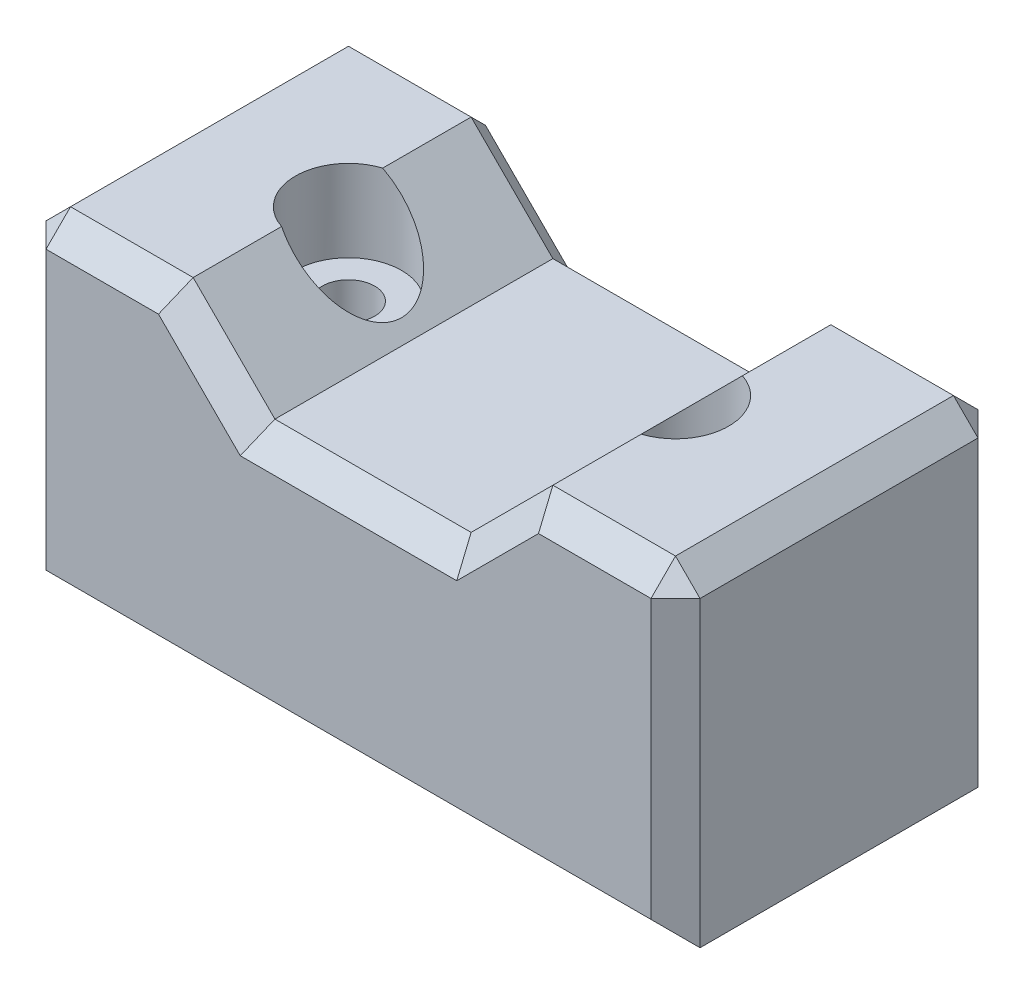
ISO-10303-21;
HEADER;
FILE_DESCRIPTION(('STEP AP214'),'2;1');
FILE_NAME('part.step','',(''),(''),'','','');
FILE_SCHEMA(('AUTOMOTIVE_DESIGN { 1 0 10303 214 1 1 1 1 }'));
ENDSEC;
DATA;
#1=APPLICATION_CONTEXT('core data for automotive mechanical design processes');
#2=APPLICATION_PROTOCOL_DEFINITION('international standard','automotive_design',2000,#1);
#3=PRODUCT_CONTEXT('',#1,'mechanical');
#4=PRODUCT('Part','Part','',(#3));
#5=PRODUCT_RELATED_PRODUCT_CATEGORY('part','',(#4));
#6=PRODUCT_DEFINITION_FORMATION('','',#4);
#7=PRODUCT_DEFINITION_CONTEXT('part definition',#1,'design');
#8=PRODUCT_DEFINITION('design','',#6,#7);
#9=PRODUCT_DEFINITION_SHAPE('','',#8);
#10=(LENGTH_UNIT() NAMED_UNIT(*) SI_UNIT(.MILLI.,.METRE.));
#11=(NAMED_UNIT(*) PLANE_ANGLE_UNIT() SI_UNIT($,.RADIAN.));
#12=(NAMED_UNIT(*) SI_UNIT($,.STERADIAN.) SOLID_ANGLE_UNIT());
#13=UNCERTAINTY_MEASURE_WITH_UNIT(LENGTH_MEASURE(1.E-05),#10,'distance_accuracy_value','');
#14=(GEOMETRIC_REPRESENTATION_CONTEXT(3) GLOBAL_UNCERTAINTY_ASSIGNED_CONTEXT((#13)) GLOBAL_UNIT_ASSIGNED_CONTEXT((#10,
#11,#12)) REPRESENTATION_CONTEXT('',''));
#15=CARTESIAN_POINT('',(0.,0.,0.));
#16=DIRECTION('',(0.,0.,1.));
#17=DIRECTION('',(1.,0.,0.));
#18=AXIS2_PLACEMENT_3D('',#15,#16,#17);
#19=CARTESIAN_POINT('',(0.,20.,0.));
#20=DIRECTION('',(0.,-1.,0.));
#21=DIRECTION('',(0.,0.,-1.));
#22=AXIS2_PLACEMENT_3D('',#19,#20,#21);
#23=PLANE('',#22);
#24=DIRECTION('',(0.,0.,1.));
#25=VECTOR('',#24,1.);
#26=CARTESIAN_POINT('',(-18.5,20.,0.));
#27=LINE('',#26,#25);
#28=CARTESIAN_POINT('',(-18.5,20.,-8.5));
#29=VERTEX_POINT('',#28);
#30=CARTESIAN_POINT('',(-18.5,20.,8.5));
#31=VERTEX_POINT('',#30);
#32=EDGE_CURVE('E276',#29,#31,#27,.T.);
#33=ORIENTED_EDGE('',*,*,#32,.T.);
#34=DIRECTION('',(1.,0.,0.));
#35=VECTOR('',#34,1.);
#36=CARTESIAN_POINT('',(0.,20.,8.5));
#37=LINE('',#36,#35);
#38=CARTESIAN_POINT('',(-11.,20.,8.5));
#39=VERTEX_POINT('',#38);
#40=EDGE_CURVE('E280',#31,#39,#37,.T.);
#41=ORIENTED_EDGE('',*,*,#40,.T.);
#42=DIRECTION('',(0.,0.,1.));
#43=VECTOR('',#42,1.);
#44=CARTESIAN_POINT('',(-11.,20.,-10.));
#45=LINE('',#44,#43);
#46=CARTESIAN_POINT('',(-11.,20.,3.09232921921325));
#47=VERTEX_POINT('',#46);
#48=EDGE_CURVE('E197',#47,#39,#45,.T.);
#49=ORIENTED_EDGE('',*,*,#48,.F.);
#50=CARTESIAN_POINT('',(-10.,20.,0.));
#51=DIRECTION('',(0.,1.,0.));
#52=DIRECTION('',(0.,0.,1.));
#53=AXIS2_PLACEMENT_3D('',#50,#51,#52);
#54=CIRCLE('',#53,3.25);
#55=CARTESIAN_POINT('',(-11.,20.,-3.09232921921323));
#56=VERTEX_POINT('',#55);
#57=EDGE_CURVE('E362',#56,#47,#54,.T.);
#58=ORIENTED_EDGE('',*,*,#57,.F.);
#59=CARTESIAN_POINT('',(-11.,20.,-8.5));
#60=VERTEX_POINT('',#59);
#61=EDGE_CURVE('E201',#60,#56,#45,.T.);
#62=ORIENTED_EDGE('',*,*,#61,.F.);
#63=DIRECTION('',(-1.,0.,0.));
#64=VECTOR('',#63,1.);
#65=CARTESIAN_POINT('',(0.,20.,-8.5));
#66=LINE('',#65,#64);
#67=EDGE_CURVE('E278',#60,#29,#66,.T.);
#68=ORIENTED_EDGE('',*,*,#67,.T.);
#69=EDGE_LOOP('',(#33,#41,#49,#58,#62,#68));
#70=FACE_BOUND('',#69,.T.);
#71=ADVANCED_FACE('F35',(#70),#23,.F.);
#72=DIRECTION('',(0.,0.,1.));
#73=VECTOR('',#72,1.);
#74=CARTESIAN_POINT('',(11.,20.,-10.));
#75=LINE('',#74,#73);
#76=CARTESIAN_POINT('',(11.,20.,3.09232921921325));
#77=VERTEX_POINT('',#76);
#78=CARTESIAN_POINT('',(11.,20.,8.5));
#79=VERTEX_POINT('',#78);
#80=EDGE_CURVE('E185',#77,#79,#75,.T.);
#81=ORIENTED_EDGE('',*,*,#80,.T.);
#82=DIRECTION('',(1.,0.,0.));
#83=VECTOR('',#82,1.);
#84=CARTESIAN_POINT('',(0.,20.,8.5));
#85=LINE('',#84,#83);
#86=CARTESIAN_POINT('',(18.5,20.,8.5));
#87=VERTEX_POINT('',#86);
#88=EDGE_CURVE('E249',#79,#87,#85,.T.);
#89=ORIENTED_EDGE('',*,*,#88,.T.);
#90=DIRECTION('',(0.,0.,-1.));
#91=VECTOR('',#90,1.);
#92=CARTESIAN_POINT('',(18.5,20.,0.));
#93=LINE('',#92,#91);
#94=CARTESIAN_POINT('',(18.5,20.,-8.5));
#95=VERTEX_POINT('',#94);
#96=EDGE_CURVE('E247',#87,#95,#93,.T.);
#97=ORIENTED_EDGE('',*,*,#96,.T.);
#98=DIRECTION('',(-1.,0.,0.));
#99=VECTOR('',#98,1.);
#100=CARTESIAN_POINT('',(0.,20.,-8.5));
#101=LINE('',#100,#99);
#102=CARTESIAN_POINT('',(11.,20.,-8.49999999999999));
#103=VERTEX_POINT('',#102);
#104=EDGE_CURVE('E245',#95,#103,#101,.T.);
#105=ORIENTED_EDGE('',*,*,#104,.T.);
#106=CARTESIAN_POINT('',(11.,20.,-3.09232921921325));
#107=VERTEX_POINT('',#106);
#108=EDGE_CURVE('E186',#103,#107,#75,.T.);
#109=ORIENTED_EDGE('',*,*,#108,.T.);
#110=CARTESIAN_POINT('',(9.99999999999999,20.,0.));
#111=DIRECTION('',(0.,1.,0.));
#112=DIRECTION('',(0.,0.,1.));
#113=AXIS2_PLACEMENT_3D('',#110,#111,#112);
#114=CIRCLE('',#113,3.25);
#115=EDGE_CURVE('E175',#77,#107,#114,.T.);
#116=ORIENTED_EDGE('',*,*,#115,.F.);
#117=EDGE_LOOP('',(#81,#89,#97,#105,#109,#116));
#118=FACE_BOUND('',#117,.T.);
#119=ADVANCED_FACE('F184',(#118),#23,.F.);
#120=CARTESIAN_POINT('',(0.,0.,0.));
#121=DIRECTION('',(0.,-1.,0.));
#122=DIRECTION('',(0.,0.,-1.));
#123=AXIS2_PLACEMENT_3D('',#120,#121,#122);
#124=PLANE('',#123);
#125=CARTESIAN_POINT('',(9.99999999999999,0.,0.));
#126=DIRECTION('',(0.,1.,0.));
#127=DIRECTION('',(0.,0.,1.));
#128=AXIS2_PLACEMENT_3D('',#125,#126,#127);
#129=CIRCLE('',#128,1.6);
#130=CARTESIAN_POINT('',(9.99999999999999,0.,1.6));
#131=VERTEX_POINT('',#130);
#132=EDGE_CURVE('E210',#131,#131,#129,.T.);
#133=ORIENTED_EDGE('',*,*,#132,.T.);
#134=EDGE_LOOP('',(#133));
#135=FACE_BOUND('',#134,.T.);
#136=DIRECTION('',(0.,0.,-1.));
#137=VECTOR('',#136,1.);
#138=CARTESIAN_POINT('',(20.,0.,10.));
#139=LINE('',#138,#137);
#140=CARTESIAN_POINT('',(20.,0.,8.49999999999999));
#141=VERTEX_POINT('',#140);
#142=CARTESIAN_POINT('',(20.,0.,-8.49999999999999));
#143=VERTEX_POINT('',#142);
#144=EDGE_CURVE('E213',#141,#143,#139,.T.);
#145=ORIENTED_EDGE('',*,*,#144,.F.);
#146=DIRECTION('',(-1.,0.,0.));
#147=VECTOR('',#146,1.);
#148=CARTESIAN_POINT('',(-20.,0.,8.49999999999999));
#149=LINE('',#148,#147);
#150=CARTESIAN_POINT('',(-20.,0.,8.49999999999999));
#151=VERTEX_POINT('',#150);
#152=EDGE_CURVE('E260',#141,#151,#149,.T.);
#153=ORIENTED_EDGE('',*,*,#152,.T.);
#154=DIRECTION('',(0.,0.,1.));
#155=VECTOR('',#154,1.);
#156=CARTESIAN_POINT('',(-20.,0.,10.));
#157=LINE('',#156,#155);
#158=CARTESIAN_POINT('',(-20.,0.,-8.49999999999999));
#159=VERTEX_POINT('',#158);
#160=EDGE_CURVE('E180',#159,#151,#157,.T.);
#161=ORIENTED_EDGE('',*,*,#160,.F.);
#162=DIRECTION('',(1.,0.,0.));
#163=VECTOR('',#162,1.);
#164=CARTESIAN_POINT('',(20.,0.,-8.49999999999999));
#165=LINE('',#164,#163);
#166=EDGE_CURVE('E258',#159,#143,#165,.T.);
#167=ORIENTED_EDGE('',*,*,#166,.T.);
#168=EDGE_LOOP('',(#145,#153,#161,#167));
#169=FACE_BOUND('',#168,.T.);
#170=CARTESIAN_POINT('',(-10.,0.,0.));
#171=DIRECTION('',(0.,1.,0.));
#172=DIRECTION('',(0.,0.,-1.));
#173=AXIS2_PLACEMENT_3D('',#170,#171,#172);
#174=CIRCLE('',#173,1.6);
#175=CARTESIAN_POINT('',(-10.,0.,-1.59999999999999));
#176=VERTEX_POINT('',#175);
#177=EDGE_CURVE('E207',#176,#176,#174,.T.);
#178=ORIENTED_EDGE('',*,*,#177,.T.);
#179=EDGE_LOOP('',(#178));
#180=FACE_BOUND('',#179,.T.);
#181=ADVANCED_FACE('F396',(#135,#169,#180),#124,.T.);
#182=CARTESIAN_POINT('',(20.,20.,10.));
#183=DIRECTION('',(-1.,0.,0.));
#184=DIRECTION('',(0.,0.,1.));
#185=AXIS2_PLACEMENT_3D('',#182,#183,#184);
#186=PLANE('',#185);
#187=DIRECTION('',(0.,0.,1.));
#188=VECTOR('',#187,1.);
#189=CARTESIAN_POINT('',(20.,18.5,10.));
#190=LINE('',#189,#188);
#191=CARTESIAN_POINT('',(20.,18.5,-8.49999999999999));
#192=VERTEX_POINT('',#191);
#193=CARTESIAN_POINT('',(20.,18.5,8.5));
#194=VERTEX_POINT('',#193);
#195=EDGE_CURVE('E251',#192,#194,#190,.T.);
#196=ORIENTED_EDGE('',*,*,#195,.T.);
#197=DIRECTION('',(0.,-1.,0.));
#198=VECTOR('',#197,1.);
#199=CARTESIAN_POINT('',(20.,20.,8.5));
#200=LINE('',#199,#198);
#201=EDGE_CURVE('E255',#194,#141,#200,.T.);
#202=ORIENTED_EDGE('',*,*,#201,.T.);
#203=ORIENTED_EDGE('',*,*,#144,.T.);
#204=DIRECTION('',(0.,1.,0.));
#205=VECTOR('',#204,1.);
#206=CARTESIAN_POINT('',(20.,20.,-8.49999999999999));
#207=LINE('',#206,#205);
#208=EDGE_CURVE('E253',#143,#192,#207,.T.);
#209=ORIENTED_EDGE('',*,*,#208,.T.);
#210=EDGE_LOOP('',(#196,#202,#203,#209));
#211=FACE_BOUND('',#210,.T.);
#212=ADVANCED_FACE('F403',(#211),#186,.F.);
#213=CARTESIAN_POINT('',(-20.,20.,-10.));
#214=DIRECTION('',(0.,0.,1.));
#215=DIRECTION('',(1.,0.,0.));
#216=AXIS2_PLACEMENT_3D('',#213,#214,#215);
#217=PLANE('',#216);
#218=DIRECTION('',(-1.,0.,0.));
#219=VECTOR('',#218,1.);
#220=CARTESIAN_POINT('',(-20.,1.5,-10.));
#221=LINE('',#220,#219);
#222=CARTESIAN_POINT('',(18.5,1.5,-10.));
#223=VERTEX_POINT('',#222);
#224=CARTESIAN_POINT('',(-18.5,1.5,-10.));
#225=VERTEX_POINT('',#224);
#226=EDGE_CURVE('E45',#223,#225,#221,.T.);
#227=ORIENTED_EDGE('',*,*,#226,.T.);
#228=DIRECTION('',(0.,1.,0.));
#229=VECTOR('',#228,1.);
#230=CARTESIAN_POINT('',(-18.5,20.,-10.));
#231=LINE('',#230,#229);
#232=CARTESIAN_POINT('',(-18.5,18.5,-10.));
#233=VERTEX_POINT('',#232);
#234=EDGE_CURVE('E11',#225,#233,#231,.T.);
#235=ORIENTED_EDGE('',*,*,#234,.T.);
#236=DIRECTION('',(1.,0.,0.));
#237=VECTOR('',#236,1.);
#238=CARTESIAN_POINT('',(-20.,18.5,-10.));
#239=LINE('',#238,#237);
#240=CARTESIAN_POINT('',(-11.6213203435597,18.5,-10.));
#241=VERTEX_POINT('',#240);
#242=EDGE_CURVE('E282',#233,#241,#239,.T.);
#243=ORIENTED_EDGE('',*,*,#242,.T.);
#244=DIRECTION('',(0.707106781186548,-0.707106781186547,0.));
#245=VECTOR('',#244,1.);
#246=CARTESIAN_POINT('',(-16.5606601717798,23.4393398282202,-10.));
#247=LINE('',#246,#245);
#248=CARTESIAN_POINT('',(-6.62132034355964,13.5,-10.));
#249=VERTEX_POINT('',#248);
#250=EDGE_CURVE('E284',#241,#249,#247,.T.);
#251=ORIENTED_EDGE('',*,*,#250,.T.);
#252=DIRECTION('',(1.,0.,0.));
#253=VECTOR('',#252,1.);
#254=CARTESIAN_POINT('',(-20.,13.5,-10.));
#255=LINE('',#254,#253);
#256=CARTESIAN_POINT('',(6.62132034355965,13.5,-10.));
#257=VERTEX_POINT('',#256);
#258=EDGE_CURVE('E286',#249,#257,#255,.T.);
#259=ORIENTED_EDGE('',*,*,#258,.T.);
#260=DIRECTION('',(0.707106781186546,0.707106781186549,0.));
#261=VECTOR('',#260,1.);
#262=CARTESIAN_POINT('',(-3.43933982822012,3.43933982822019,-10.));
#263=LINE('',#262,#261);
#264=CARTESIAN_POINT('',(11.6213203435596,18.5,-10.));
#265=VERTEX_POINT('',#264);
#266=EDGE_CURVE('E288',#257,#265,#263,.T.);
#267=ORIENTED_EDGE('',*,*,#266,.T.);
#268=DIRECTION('',(1.,0.,0.));
#269=VECTOR('',#268,1.);
#270=CARTESIAN_POINT('',(-20.,18.5,-10.));
#271=LINE('',#270,#269);
#272=CARTESIAN_POINT('',(18.5,18.5,-10.));
#273=VERTEX_POINT('',#272);
#274=EDGE_CURVE('E290',#265,#273,#271,.T.);
#275=ORIENTED_EDGE('',*,*,#274,.T.);
#276=DIRECTION('',(0.,-1.,0.));
#277=VECTOR('',#276,1.);
#278=CARTESIAN_POINT('',(18.5,20.,-10.));
#279=LINE('',#278,#277);
#280=EDGE_CURVE('E56',#273,#223,#279,.T.);
#281=ORIENTED_EDGE('',*,*,#280,.T.);
#282=EDGE_LOOP('',(#227,#235,#243,#251,#259,#267,#275,#281));
#283=FACE_BOUND('',#282,.T.);
#284=ADVANCED_FACE('F412',(#283),#217,.F.);
#285=CARTESIAN_POINT('',(-20.,20.,10.));
#286=DIRECTION('',(1.,0.,0.));
#287=DIRECTION('',(0.,0.,-1.));
#288=AXIS2_PLACEMENT_3D('',#285,#286,#287);
#289=PLANE('',#288);
#290=ORIENTED_EDGE('',*,*,#160,.T.);
#291=DIRECTION('',(0.,1.,0.));
#292=VECTOR('',#291,1.);
#293=CARTESIAN_POINT('',(-20.,20.,8.49999999999999));
#294=LINE('',#293,#292);
#295=CARTESIAN_POINT('',(-20.,18.5,8.49999999999999));
#296=VERTEX_POINT('',#295);
#297=EDGE_CURVE('E266',#151,#296,#294,.T.);
#298=ORIENTED_EDGE('',*,*,#297,.T.);
#299=DIRECTION('',(0.,0.,-1.));
#300=VECTOR('',#299,1.);
#301=CARTESIAN_POINT('',(-20.,18.5,10.));
#302=LINE('',#301,#300);
#303=CARTESIAN_POINT('',(-20.,18.5,-8.49999999999999));
#304=VERTEX_POINT('',#303);
#305=EDGE_CURVE('E262',#296,#304,#302,.T.);
#306=ORIENTED_EDGE('',*,*,#305,.T.);
#307=DIRECTION('',(0.,-1.,0.));
#308=VECTOR('',#307,1.);
#309=CARTESIAN_POINT('',(-20.,20.,-8.49999999999999));
#310=LINE('',#309,#308);
#311=EDGE_CURVE('E264',#304,#159,#310,.T.);
#312=ORIENTED_EDGE('',*,*,#311,.T.);
#313=EDGE_LOOP('',(#290,#298,#306,#312));
#314=FACE_BOUND('',#313,.T.);
#315=ADVANCED_FACE('F408',(#314),#289,.F.);
#316=CARTESIAN_POINT('',(-20.,20.,10.));
#317=DIRECTION('',(0.,0.,-1.));
#318=DIRECTION('',(-1.,0.,0.));
#319=AXIS2_PLACEMENT_3D('',#316,#317,#318);
#320=PLANE('',#319);
#321=DIRECTION('',(-1.,0.,0.));
#322=VECTOR('',#321,1.);
#323=CARTESIAN_POINT('',(-20.,18.5,10.));
#324=LINE('',#323,#322);
#325=CARTESIAN_POINT('',(18.5,18.5,10.));
#326=VERTEX_POINT('',#325);
#327=CARTESIAN_POINT('',(11.6213203435596,18.5,10.));
#328=VERTEX_POINT('',#327);
#329=EDGE_CURVE('E240',#326,#328,#324,.T.);
#330=ORIENTED_EDGE('',*,*,#329,.T.);
#331=DIRECTION('',(-0.707106781186546,-0.707106781186549,0.));
#332=VECTOR('',#331,1.);
#333=CARTESIAN_POINT('',(-3.43933982822012,3.43933982822019,10.));
#334=LINE('',#333,#332);
#335=CARTESIAN_POINT('',(6.62132034355965,13.5,10.));
#336=VERTEX_POINT('',#335);
#337=EDGE_CURVE('E242',#328,#336,#334,.T.);
#338=ORIENTED_EDGE('',*,*,#337,.T.);
#339=DIRECTION('',(-1.,0.,0.));
#340=VECTOR('',#339,1.);
#341=CARTESIAN_POINT('',(-20.,13.5,10.));
#342=LINE('',#341,#340);
#343=CARTESIAN_POINT('',(-6.62132034355965,13.5,10.));
#344=VERTEX_POINT('',#343);
#345=EDGE_CURVE('E232',#336,#344,#342,.T.);
#346=ORIENTED_EDGE('',*,*,#345,.T.);
#347=DIRECTION('',(-0.707106781186548,0.707106781186547,0.));
#348=VECTOR('',#347,1.);
#349=CARTESIAN_POINT('',(-16.5606601717799,23.4393398282202,10.));
#350=LINE('',#349,#348);
#351=CARTESIAN_POINT('',(-11.6213203435597,18.5,10.));
#352=VERTEX_POINT('',#351);
#353=EDGE_CURVE('E230',#344,#352,#350,.T.);
#354=ORIENTED_EDGE('',*,*,#353,.T.);
#355=DIRECTION('',(-1.,0.,0.));
#356=VECTOR('',#355,1.);
#357=CARTESIAN_POINT('',(-20.,18.5,10.));
#358=LINE('',#357,#356);
#359=CARTESIAN_POINT('',(-18.5,18.5,10.));
#360=VERTEX_POINT('',#359);
#361=EDGE_CURVE('E228',#352,#360,#358,.T.);
#362=ORIENTED_EDGE('',*,*,#361,.T.);
#363=DIRECTION('',(0.,-1.,0.));
#364=VECTOR('',#363,1.);
#365=CARTESIAN_POINT('',(-18.5,20.,10.));
#366=LINE('',#365,#364);
#367=CARTESIAN_POINT('',(-18.5,1.5,10.));
#368=VERTEX_POINT('',#367);
#369=EDGE_CURVE('E234',#360,#368,#366,.T.);
#370=ORIENTED_EDGE('',*,*,#369,.T.);
#371=DIRECTION('',(1.,0.,0.));
#372=VECTOR('',#371,1.);
#373=CARTESIAN_POINT('',(20.,1.5,10.));
#374=LINE('',#373,#372);
#375=CARTESIAN_POINT('',(18.5,1.5,10.));
#376=VERTEX_POINT('',#375);
#377=EDGE_CURVE('E236',#368,#376,#374,.T.);
#378=ORIENTED_EDGE('',*,*,#377,.T.);
#379=DIRECTION('',(0.,1.,0.));
#380=VECTOR('',#379,1.);
#381=CARTESIAN_POINT('',(18.5,20.,10.));
#382=LINE('',#381,#380);
#383=EDGE_CURVE('E238',#376,#326,#382,.T.);
#384=ORIENTED_EDGE('',*,*,#383,.T.);
#385=EDGE_LOOP('',(#330,#338,#346,#354,#362,#370,#378,#384));
#386=FACE_BOUND('',#385,.T.);
#387=ADVANCED_FACE('F405',(#386),#320,.F.);
#388=CARTESIAN_POINT('',(9.99999999999999,20.,0.));
#389=DIRECTION('',(0.,-1.,0.));
#390=DIRECTION('',(0.,0.,-1.));
#391=AXIS2_PLACEMENT_3D('',#388,#389,#390);
#392=CYLINDRICAL_SURFACE('',#391,1.6);
#393=CARTESIAN_POINT('',(9.99999999999999,15.,0.));
#394=DIRECTION('',(0.,-1.,0.));
#395=DIRECTION('',(1.,0.,0.));
#396=AXIS2_PLACEMENT_3D('',#393,#394,#395);
#397=CIRCLE('',#396,1.6);
#398=CARTESIAN_POINT('',(11.6,15.,0.));
#399=VERTEX_POINT('',#398);
#400=EDGE_CURVE('E206',#399,#399,#397,.T.);
#401=ORIENTED_EDGE('',*,*,#400,.F.);
#402=EDGE_LOOP('',(#401));
#403=FACE_BOUND('',#402,.T.);
#404=ORIENTED_EDGE('',*,*,#132,.F.);
#405=EDGE_LOOP('',(#404));
#406=FACE_BOUND('',#405,.T.);
#407=ADVANCED_FACE('F399',(#403,#406),#392,.F.);
#408=CARTESIAN_POINT('',(-10.,20.,0.));
#409=DIRECTION('',(0.,-1.,0.));
#410=DIRECTION('',(0.,0.,-1.));
#411=AXIS2_PLACEMENT_3D('',#408,#409,#410);
#412=CYLINDRICAL_SURFACE('',#411,1.6);
#413=CARTESIAN_POINT('',(-10.,15.,0.));
#414=DIRECTION('',(0.,-1.,0.));
#415=DIRECTION('',(1.,0.,0.));
#416=AXIS2_PLACEMENT_3D('',#413,#414,#415);
#417=CIRCLE('',#416,1.6);
#418=CARTESIAN_POINT('',(-8.4,15.,0.));
#419=VERTEX_POINT('',#418);
#420=EDGE_CURVE('E221',#419,#419,#417,.T.);
#421=ORIENTED_EDGE('',*,*,#420,.F.);
#422=EDGE_LOOP('',(#421));
#423=FACE_BOUND('',#422,.T.);
#424=ORIENTED_EDGE('',*,*,#177,.F.);
#425=EDGE_LOOP('',(#424));
#426=FACE_BOUND('',#425,.T.);
#427=ADVANCED_FACE('F635',(#423,#426),#412,.F.);
#428=CARTESIAN_POINT('',(-6.,15.,-10.));
#429=DIRECTION('',(-0.707106781186547,-0.707106781186548,0.));
#430=DIRECTION('',(0.707106781186548,-0.707106781186547,0.));
#431=AXIS2_PLACEMENT_3D('',#428,#429,#430);
#432=PLANE('',#431);
#433=ORIENTED_EDGE('',*,*,#48,.T.);
#434=DIRECTION('',(0.707106781186548,-0.707106781186547,0.));
#435=VECTOR('',#434,1.);
#436=CARTESIAN_POINT('',(-6.,15.,8.5));
#437=LINE('',#436,#435);
#438=CARTESIAN_POINT('',(-6.,15.,8.5));
#439=VERTEX_POINT('',#438);
#440=EDGE_CURVE('E274',#39,#439,#437,.T.);
#441=ORIENTED_EDGE('',*,*,#440,.T.);
#442=DIRECTION('',(0.,0.,1.));
#443=VECTOR('',#442,1.);
#444=CARTESIAN_POINT('',(-6.,15.,-10.));
#445=LINE('',#444,#443);
#446=CARTESIAN_POINT('',(-6.,15.,-8.49999999999999));
#447=VERTEX_POINT('',#446);
#448=EDGE_CURVE('E198',#447,#439,#445,.T.);
#449=ORIENTED_EDGE('',*,*,#448,.F.);
#450=DIRECTION('',(-0.707106781186548,0.707106781186547,0.));
#451=VECTOR('',#450,1.);
#452=CARTESIAN_POINT('',(-6.,15.,-8.49999999999999));
#453=LINE('',#452,#451);
#454=EDGE_CURVE('E272',#447,#60,#453,.T.);
#455=ORIENTED_EDGE('',*,*,#454,.T.);
#456=ORIENTED_EDGE('',*,*,#61,.T.);
#457=CARTESIAN_POINT('',(-10.,19.,0.));
#458=DIRECTION('',(-0.707106781186547,-0.707106781186548,0.));
#459=DIRECTION('',(-0.707106781186548,0.707106781186547,0.));
#460=AXIS2_PLACEMENT_3D('',#457,#458,#459);
#461=ELLIPSE('',#460,4.59619407771255,3.25);
#462=EDGE_CURVE('E179',#56,#47,#461,.T.);
#463=ORIENTED_EDGE('',*,*,#462,.T.);
#464=EDGE_LOOP('',(#433,#441,#449,#455,#456,#463));
#465=FACE_BOUND('',#464,.T.);
#466=ADVANCED_FACE('F590',(#465),#432,.F.);
#467=CARTESIAN_POINT('',(6.,15.,-10.));
#468=DIRECTION('',(0.707106781186549,-0.707106781186546,0.));
#469=DIRECTION('',(0.707106781186546,0.707106781186549,0.));
#470=AXIS2_PLACEMENT_3D('',#467,#468,#469);
#471=PLANE('',#470);
#472=DIRECTION('',(0.,0.,1.));
#473=VECTOR('',#472,1.);
#474=CARTESIAN_POINT('',(6.,15.,-10.));
#475=LINE('',#474,#473);
#476=CARTESIAN_POINT('',(6.,15.,-8.49999999999999));
#477=VERTEX_POINT('',#476);
#478=CARTESIAN_POINT('',(6.,15.,8.5));
#479=VERTEX_POINT('',#478);
#480=EDGE_CURVE('E195',#477,#479,#475,.T.);
#481=ORIENTED_EDGE('',*,*,#480,.T.);
#482=DIRECTION('',(0.707106781186546,0.707106781186549,0.));
#483=VECTOR('',#482,1.);
#484=CARTESIAN_POINT('',(6.,15.,8.5));
#485=LINE('',#484,#483);
#486=EDGE_CURVE('E194',#479,#79,#485,.T.);
#487=ORIENTED_EDGE('',*,*,#486,.T.);
#488=ORIENTED_EDGE('',*,*,#80,.F.);
#489=CARTESIAN_POINT('',(9.99999999999999,19.,0.));
#490=DIRECTION('',(0.707106781186549,-0.707106781186546,0.));
#491=DIRECTION('',(0.707106781186546,0.707106781186549,0.));
#492=AXIS2_PLACEMENT_3D('',#489,#490,#491);
#493=ELLIPSE('',#492,4.59619407771257,3.25);
#494=EDGE_CURVE('E172',#77,#107,#493,.T.);
#495=ORIENTED_EDGE('',*,*,#494,.T.);
#496=ORIENTED_EDGE('',*,*,#108,.F.);
#497=DIRECTION('',(-0.707106781186546,-0.707106781186549,0.));
#498=VECTOR('',#497,1.);
#499=CARTESIAN_POINT('',(6.,15.,-8.49999999999999));
#500=LINE('',#499,#498);
#501=EDGE_CURVE('E220',#103,#477,#500,.T.);
#502=ORIENTED_EDGE('',*,*,#501,.T.);
#503=EDGE_LOOP('',(#481,#487,#488,#495,#496,#502));
#504=FACE_BOUND('',#503,.T.);
#505=ADVANCED_FACE('F192',(#504),#471,.F.);
#506=CARTESIAN_POINT('',(-6.,15.,-10.));
#507=DIRECTION('',(0.,-1.,0.));
#508=DIRECTION('',(1.,0.,0.));
#509=AXIS2_PLACEMENT_3D('',#506,#507,#508);
#510=PLANE('',#509);
#511=ORIENTED_EDGE('',*,*,#448,.T.);
#512=DIRECTION('',(1.,0.,0.));
#513=VECTOR('',#512,1.);
#514=CARTESIAN_POINT('',(-6.,15.,8.5));
#515=LINE('',#514,#513);
#516=EDGE_CURVE('E270',#439,#479,#515,.T.);
#517=ORIENTED_EDGE('',*,*,#516,.T.);
#518=ORIENTED_EDGE('',*,*,#480,.F.);
#519=DIRECTION('',(-1.,0.,0.));
#520=VECTOR('',#519,1.);
#521=CARTESIAN_POINT('',(-6.,15.,-8.49999999999999));
#522=LINE('',#521,#520);
#523=EDGE_CURVE('E268',#477,#447,#522,.T.);
#524=ORIENTED_EDGE('',*,*,#523,.T.);
#525=EDGE_LOOP('',(#511,#517,#518,#524));
#526=FACE_BOUND('',#525,.T.);
#527=ADVANCED_FACE('F379',(#526),#510,.F.);
#528=CARTESIAN_POINT('',(9.99999999999999,5.80761184457486,0.));
#529=DIRECTION('',(0.,1.,0.));
#530=DIRECTION('',(0.,0.,1.));
#531=AXIS2_PLACEMENT_3D('',#528,#529,#530);
#532=CYLINDRICAL_SURFACE('',#531,3.25);
#533=CARTESIAN_POINT('',(9.99999999999999,15.,0.));
#534=DIRECTION('',(0.,-1.,0.));
#535=DIRECTION('',(1.,0.,0.));
#536=AXIS2_PLACEMENT_3D('',#533,#534,#535);
#537=CIRCLE('',#536,3.25);
#538=CARTESIAN_POINT('',(13.25,15.,0.));
#539=VERTEX_POINT('',#538);
#540=EDGE_CURVE('E187',#539,#539,#537,.F.);
#541=ORIENTED_EDGE('',*,*,#540,.F.);
#542=EDGE_LOOP('',(#541));
#543=FACE_BOUND('',#542,.T.);
#544=ORIENTED_EDGE('',*,*,#115,.T.);
#545=ORIENTED_EDGE('',*,*,#494,.F.);
#546=EDGE_LOOP('',(#544,#545));
#547=FACE_BOUND('',#546,.T.);
#548=ADVANCED_FACE('F174',(#543,#547),#532,.F.);
#549=CARTESIAN_POINT('',(-6.,15.,-10.));
#550=DIRECTION('',(0.,-1.,0.));
#551=DIRECTION('',(1.,0.,0.));
#552=AXIS2_PLACEMENT_3D('',#549,#550,#551);
#553=PLANE('',#552);
#554=ORIENTED_EDGE('',*,*,#400,.T.);
#555=EDGE_LOOP('',(#554));
#556=FACE_BOUND('',#555,.T.);
#557=ORIENTED_EDGE('',*,*,#540,.T.);
#558=EDGE_LOOP('',(#557));
#559=FACE_BOUND('',#558,.T.);
#560=ADVANCED_FACE('F376',(#556,#559),#553,.F.);
#561=CARTESIAN_POINT('',(-10.,5.80761184457486,0.));
#562=DIRECTION('',(0.,1.,0.));
#563=DIRECTION('',(0.,0.,1.));
#564=AXIS2_PLACEMENT_3D('',#561,#562,#563);
#565=CYLINDRICAL_SURFACE('',#564,3.25);
#566=CARTESIAN_POINT('',(-10.,15.,0.));
#567=DIRECTION('',(0.,-1.,0.));
#568=DIRECTION('',(1.,0.,0.));
#569=AXIS2_PLACEMENT_3D('',#566,#567,#568);
#570=CIRCLE('',#569,3.25);
#571=CARTESIAN_POINT('',(-6.75,15.,0.));
#572=VERTEX_POINT('',#571);
#573=EDGE_CURVE('E188',#572,#572,#570,.F.);
#574=ORIENTED_EDGE('',*,*,#573,.F.);
#575=EDGE_LOOP('',(#574));
#576=FACE_BOUND('',#575,.T.);
#577=ORIENTED_EDGE('',*,*,#57,.T.);
#578=ORIENTED_EDGE('',*,*,#462,.F.);
#579=EDGE_LOOP('',(#577,#578));
#580=FACE_BOUND('',#579,.T.);
#581=ADVANCED_FACE('F385',(#576,#580),#565,.F.);
#582=CARTESIAN_POINT('',(-6.,15.,-10.));
#583=DIRECTION('',(0.,-1.,0.));
#584=DIRECTION('',(1.,0.,0.));
#585=AXIS2_PLACEMENT_3D('',#582,#583,#584);
#586=PLANE('',#585);
#587=ORIENTED_EDGE('',*,*,#420,.T.);
#588=EDGE_LOOP('',(#587));
#589=FACE_BOUND('',#588,.T.);
#590=ORIENTED_EDGE('',*,*,#573,.T.);
#591=EDGE_LOOP('',(#590));
#592=FACE_BOUND('',#591,.T.);
#593=ADVANCED_FACE('F565',(#589,#592),#586,.F.);
#594=CARTESIAN_POINT('',(-16.5606601717798,23.4393398282202,-10.));
#595=DIRECTION('',(-0.500000000000001,-0.500000000000002,0.707106781186546));
#596=DIRECTION('',(0.707106781186548,-0.707106781186547,0.));
#597=AXIS2_PLACEMENT_3D('',#594,#595,#596);
#598=PLANE('',#597);
#599=DIRECTION('',(-0.281084637714818,-0.678598344545846,-0.678598344545849));
#600=VECTOR('',#599,1.);
#601=CARTESIAN_POINT('',(-7.67835073932142,10.9481028827113,-12.5518971172887));
#602=LINE('',#601,#600);
#603=EDGE_CURVE('E355',#249,#447,#602,.F.);
#604=ORIENTED_EDGE('',*,*,#603,.F.);
#605=ORIENTED_EDGE('',*,*,#250,.F.);
#606=DIRECTION('',(-0.281084637714812,-0.67859834454585,-0.678598344545847));
#607=VECTOR('',#606,1.);
#608=CARTESIAN_POINT('',(-10.1309056908481,22.098179268136,-6.40182073186404));
#609=LINE('',#608,#607);
#610=EDGE_CURVE('E40',#60,#241,#609,.T.);
#611=ORIENTED_EDGE('',*,*,#610,.F.);
#612=ORIENTED_EDGE('',*,*,#454,.F.);
#613=EDGE_LOOP('',(#604,#605,#611,#612));
#614=FACE_BOUND('',#613,.T.);
#615=ADVANCED_FACE('F38',(#614),#598,.F.);
#616=CARTESIAN_POINT('',(0.,20.,-8.5));
#617=DIRECTION('',(0.,-0.707106781186546,0.707106781186549));
#618=DIRECTION('',(-1.,0.,0.));
#619=AXIS2_PLACEMENT_3D('',#616,#617,#618);
#620=PLANE('',#619);
#621=ORIENTED_EDGE('',*,*,#610,.T.);
#622=ORIENTED_EDGE('',*,*,#242,.F.);
#623=DIRECTION('',(0.,0.707106781186549,0.707106781186546));
#624=VECTOR('',#623,1.);
#625=CARTESIAN_POINT('',(-18.5,18.5,-10.));
#626=LINE('',#625,#624);
#627=EDGE_CURVE('E351',#29,#233,#626,.F.);
#628=ORIENTED_EDGE('',*,*,#627,.F.);
#629=ORIENTED_EDGE('',*,*,#67,.F.);
#630=EDGE_LOOP('',(#621,#622,#628,#629));
#631=FACE_BOUND('',#630,.T.);
#632=ADVANCED_FACE('F558',(#631),#620,.F.);
#633=CARTESIAN_POINT('',(-20.,13.5,-10.));
#634=DIRECTION('',(0.,-0.707106781186549,0.707106781186546));
#635=DIRECTION('',(1.,0.,0.));
#636=AXIS2_PLACEMENT_3D('',#633,#634,#635);
#637=PLANE('',#636);
#638=ORIENTED_EDGE('',*,*,#603,.T.);
#639=ORIENTED_EDGE('',*,*,#523,.F.);
#640=DIRECTION('',(0.281084637714821,-0.678598344545845,-0.678598344545849));
#641=VECTOR('',#640,1.);
#642=CARTESIAN_POINT('',(7.74544817034002,10.7861153547458,-12.7138846452542));
#643=LINE('',#642,#641);
#644=EDGE_CURVE('E348',#257,#477,#643,.F.);
#645=ORIENTED_EDGE('',*,*,#644,.F.);
#646=ORIENTED_EDGE('',*,*,#258,.F.);
#647=EDGE_LOOP('',(#638,#639,#645,#646));
#648=FACE_BOUND('',#647,.T.);
#649=ADVANCED_FACE('F552',(#648),#637,.F.);
#650=CARTESIAN_POINT('',(-20.,20.,-8.49999999999999));
#651=DIRECTION('',(0.707106781186549,0.,0.707106781186546));
#652=DIRECTION('',(0.,-1.,0.));
#653=AXIS2_PLACEMENT_3D('',#650,#651,#652);
#654=PLANE('',#653);
#655=DIRECTION('',(0.707106781186546,0.,-0.707106781186549));
#656=VECTOR('',#655,1.);
#657=CARTESIAN_POINT('',(-18.5,18.5,-10.));
#658=LINE('',#657,#656);
#659=EDGE_CURVE('E353',#233,#304,#658,.F.);
#660=ORIENTED_EDGE('',*,*,#659,.F.);
#661=ORIENTED_EDGE('',*,*,#234,.F.);
#662=DIRECTION('',(-0.577350269189625,-0.577350269189625,0.577350269189628));
#663=VECTOR('',#662,1.);
#664=CARTESIAN_POINT('',(-19.,1.,-9.5));
#665=LINE('',#664,#663);
#666=EDGE_CURVE('E345',#159,#225,#665,.F.);
#667=ORIENTED_EDGE('',*,*,#666,.F.);
#668=ORIENTED_EDGE('',*,*,#311,.F.);
#669=EDGE_LOOP('',(#660,#661,#667,#668));
#670=FACE_BOUND('',#669,.T.);
#671=ADVANCED_FACE('F545',(#670),#654,.F.);
#672=CARTESIAN_POINT('',(-18.5,18.5,-10.));
#673=DIRECTION('',(-0.577350269189628,0.577350269189623,-0.577350269189626));
#674=DIRECTION('',(-0.707106781186546,0.,0.707106781186549));
#675=AXIS2_PLACEMENT_3D('',#672,#673,#674);
#676=PLANE('',#675);
#677=ORIENTED_EDGE('',*,*,#627,.T.);
#678=ORIENTED_EDGE('',*,*,#659,.T.);
#679=DIRECTION('',(-0.707106781186546,-0.707106781186549,0.));
#680=VECTOR('',#679,1.);
#681=CARTESIAN_POINT('',(-19.25,19.25,-8.49999999999999));
#682=LINE('',#681,#680);
#683=EDGE_CURVE('E342',#29,#304,#682,.T.);
#684=ORIENTED_EDGE('',*,*,#683,.F.);
#685=EDGE_LOOP('',(#677,#678,#684));
#686=FACE_BOUND('',#685,.T.);
#687=ADVANCED_FACE('F538',(#686),#676,.T.);
#688=CARTESIAN_POINT('',(-3.43933982822012,3.43933982822019,-10.));
#689=DIRECTION('',(0.500000000000002,-0.5,0.707106781186546));
#690=DIRECTION('',(0.707106781186546,0.707106781186549,0.));
#691=AXIS2_PLACEMENT_3D('',#688,#689,#690);
#692=PLANE('',#691);
#693=ORIENTED_EDGE('',*,*,#644,.T.);
#694=ORIENTED_EDGE('',*,*,#501,.F.);
#695=DIRECTION('',(0.281084637714814,-0.67859834454585,-0.678598344545847));
#696=VECTOR('',#695,1.);
#697=CARTESIAN_POINT('',(13.3041231516964,14.4373546377966,-14.0626453622034));
#698=LINE('',#697,#696);
#699=EDGE_CURVE('E339',#265,#103,#698,.F.);
#700=ORIENTED_EDGE('',*,*,#699,.F.);
#701=ORIENTED_EDGE('',*,*,#266,.F.);
#702=EDGE_LOOP('',(#693,#694,#700,#701));
#703=FACE_BOUND('',#702,.T.);
#704=ADVANCED_FACE('F531',(#703),#692,.F.);
#705=CARTESIAN_POINT('',(-20.,1.5,-10.));
#706=DIRECTION('',(0.,-0.707106781186549,-0.707106781186546));
#707=DIRECTION('',(1.,0.,0.));
#708=AXIS2_PLACEMENT_3D('',#705,#706,#707);
#709=PLANE('',#708);
#710=ORIENTED_EDGE('',*,*,#666,.T.);
#711=ORIENTED_EDGE('',*,*,#226,.F.);
#712=DIRECTION('',(0.577350269189625,-0.577350269189625,0.577350269189628));
#713=VECTOR('',#712,1.);
#714=CARTESIAN_POINT('',(12.3333333333333,7.66666666666665,-16.1666666666667));
#715=LINE('',#714,#713);
#716=EDGE_CURVE('E336',#143,#223,#715,.F.);
#717=ORIENTED_EDGE('',*,*,#716,.F.);
#718=ORIENTED_EDGE('',*,*,#166,.F.);
#719=EDGE_LOOP('',(#710,#711,#717,#718));
#720=FACE_BOUND('',#719,.T.);
#721=ADVANCED_FACE('F524',(#720),#709,.T.);
#722=CARTESIAN_POINT('',(-18.5,20.,0.));
#723=DIRECTION('',(0.707106781186549,-0.707106781186546,0.));
#724=DIRECTION('',(0.,0.,1.));
#725=AXIS2_PLACEMENT_3D('',#722,#723,#724);
#726=PLANE('',#725);
#727=ORIENTED_EDGE('',*,*,#683,.T.);
#728=ORIENTED_EDGE('',*,*,#305,.F.);
#729=DIRECTION('',(0.707106781186546,0.707106781186549,0.));
#730=VECTOR('',#729,1.);
#731=CARTESIAN_POINT('',(-20.,18.5,8.49999999999999));
#732=LINE('',#731,#730);
#733=EDGE_CURVE('E330',#31,#296,#732,.F.);
#734=ORIENTED_EDGE('',*,*,#733,.F.);
#735=ORIENTED_EDGE('',*,*,#32,.F.);
#736=EDGE_LOOP('',(#727,#728,#734,#735));
#737=FACE_BOUND('',#736,.T.);
#738=ADVANCED_FACE('F517',(#737),#726,.F.);
#739=CARTESIAN_POINT('',(0.,20.,-8.5));
#740=DIRECTION('',(0.,-0.707106781186546,0.707106781186549));
#741=DIRECTION('',(-1.,0.,0.));
#742=AXIS2_PLACEMENT_3D('',#739,#740,#741);
#743=PLANE('',#742);
#744=ORIENTED_EDGE('',*,*,#699,.T.);
#745=ORIENTED_EDGE('',*,*,#104,.F.);
#746=DIRECTION('',(0.,-0.707106781186549,-0.707106781186546));
#747=VECTOR('',#746,1.);
#748=CARTESIAN_POINT('',(18.5,19.25,-9.25));
#749=LINE('',#748,#747);
#750=EDGE_CURVE('E327',#273,#95,#749,.F.);
#751=ORIENTED_EDGE('',*,*,#750,.F.);
#752=ORIENTED_EDGE('',*,*,#274,.F.);
#753=EDGE_LOOP('',(#744,#745,#751,#752));
#754=FACE_BOUND('',#753,.T.);
#755=ADVANCED_FACE('F510',(#754),#743,.F.);
#756=CARTESIAN_POINT('',(18.5,20.,-10.));
#757=DIRECTION('',(-0.707106781186549,0.,0.707106781186546));
#758=DIRECTION('',(0.,-1.,0.));
#759=AXIS2_PLACEMENT_3D('',#756,#757,#758);
#760=PLANE('',#759);
#761=ORIENTED_EDGE('',*,*,#716,.T.);
#762=ORIENTED_EDGE('',*,*,#280,.F.);
#763=DIRECTION('',(0.707106781186546,0.,0.707106781186549));
#764=VECTOR('',#763,1.);
#765=CARTESIAN_POINT('',(20.,18.5,-8.49999999999999));
#766=LINE('',#765,#764);
#767=EDGE_CURVE('E324',#192,#273,#766,.F.);
#768=ORIENTED_EDGE('',*,*,#767,.F.);
#769=ORIENTED_EDGE('',*,*,#208,.F.);
#770=EDGE_LOOP('',(#761,#762,#768,#769));
#771=FACE_BOUND('',#770,.T.);
#772=ADVANCED_FACE('F503',(#771),#760,.F.);
#773=CARTESIAN_POINT('',(-18.5,20.,10.));
#774=DIRECTION('',(0.707106781186549,0.,-0.707106781186546));
#775=DIRECTION('',(0.,-1.,0.));
#776=AXIS2_PLACEMENT_3D('',#773,#774,#775);
#777=PLANE('',#776);
#778=DIRECTION('',(-0.707106781186546,0.,-0.707106781186549));
#779=VECTOR('',#778,1.);
#780=CARTESIAN_POINT('',(-20.,18.5,8.49999999999999));
#781=LINE('',#780,#779);
#782=EDGE_CURVE('E333',#296,#360,#781,.F.);
#783=ORIENTED_EDGE('',*,*,#782,.F.);
#784=ORIENTED_EDGE('',*,*,#297,.F.);
#785=DIRECTION('',(-0.577350269189625,-0.577350269189625,-0.577350269189628));
#786=VECTOR('',#785,1.);
#787=CARTESIAN_POINT('',(-12.3333333333334,7.66666666666665,16.1666666666667));
#788=LINE('',#787,#786);
#789=EDGE_CURVE('E321',#368,#151,#788,.T.);
#790=ORIENTED_EDGE('',*,*,#789,.F.);
#791=ORIENTED_EDGE('',*,*,#369,.F.);
#792=EDGE_LOOP('',(#783,#784,#790,#791));
#793=FACE_BOUND('',#792,.T.);
#794=ADVANCED_FACE('F496',(#793),#777,.F.);
#795=CARTESIAN_POINT('',(-20.,18.5,8.49999999999999));
#796=DIRECTION('',(-0.577350269189628,0.577350269189623,0.577350269189626));
#797=DIRECTION('',(0.707106781186546,0.,0.707106781186549));
#798=AXIS2_PLACEMENT_3D('',#795,#796,#797);
#799=PLANE('',#798);
#800=ORIENTED_EDGE('',*,*,#733,.T.);
#801=ORIENTED_EDGE('',*,*,#782,.T.);
#802=DIRECTION('',(0.,-0.707106781186549,0.707106781186546));
#803=VECTOR('',#802,1.);
#804=CARTESIAN_POINT('',(-18.5,19.25,9.25));
#805=LINE('',#804,#803);
#806=EDGE_CURVE('E318',#31,#360,#805,.T.);
#807=ORIENTED_EDGE('',*,*,#806,.F.);
#808=EDGE_LOOP('',(#800,#801,#807));
#809=FACE_BOUND('',#808,.T.);
#810=ADVANCED_FACE('F489',(#809),#799,.T.);
#811=CARTESIAN_POINT('',(20.,18.5,-8.49999999999999));
#812=DIRECTION('',(0.577350269189628,0.577350269189623,-0.577350269189626));
#813=DIRECTION('',(-0.707106781186546,0.,-0.707106781186549));
#814=AXIS2_PLACEMENT_3D('',#811,#812,#813);
#815=PLANE('',#814);
#816=ORIENTED_EDGE('',*,*,#767,.T.);
#817=ORIENTED_EDGE('',*,*,#750,.T.);
#818=DIRECTION('',(-0.707106781186546,0.707106781186549,0.));
#819=VECTOR('',#818,1.);
#820=CARTESIAN_POINT('',(20.,18.5,-8.49999999999999));
#821=LINE('',#820,#819);
#822=EDGE_CURVE('E315',#192,#95,#821,.T.);
#823=ORIENTED_EDGE('',*,*,#822,.F.);
#824=EDGE_LOOP('',(#816,#817,#823));
#825=FACE_BOUND('',#824,.T.);
#826=ADVANCED_FACE('F482',(#825),#815,.T.);
#827=CARTESIAN_POINT('',(-20.,1.5,10.));
#828=DIRECTION('',(0.,-0.707106781186549,0.707106781186546));
#829=DIRECTION('',(-1.,0.,0.));
#830=AXIS2_PLACEMENT_3D('',#827,#828,#829);
#831=PLANE('',#830);
#832=ORIENTED_EDGE('',*,*,#789,.T.);
#833=ORIENTED_EDGE('',*,*,#152,.F.);
#834=DIRECTION('',(0.577350269189628,-0.577350269189623,-0.577350269189626));
#835=VECTOR('',#834,1.);
#836=CARTESIAN_POINT('',(5.66666666666654,14.3333333333333,22.8333333333334));
#837=LINE('',#836,#835);
#838=EDGE_CURVE('E313',#376,#141,#837,.T.);
#839=ORIENTED_EDGE('',*,*,#838,.F.);
#840=ORIENTED_EDGE('',*,*,#377,.F.);
#841=EDGE_LOOP('',(#832,#833,#839,#840));
#842=FACE_BOUND('',#841,.T.);
#843=ADVANCED_FACE('F475',(#842),#831,.T.);
#844=CARTESIAN_POINT('',(0.,20.,8.5));
#845=DIRECTION('',(0.,-0.707106781186546,-0.707106781186549));
#846=DIRECTION('',(1.,0.,0.));
#847=AXIS2_PLACEMENT_3D('',#844,#845,#846);
#848=PLANE('',#847);
#849=ORIENTED_EDGE('',*,*,#806,.T.);
#850=ORIENTED_EDGE('',*,*,#361,.F.);
#851=DIRECTION('',(0.281084637714822,0.678598344545848,-0.678598344545845));
#852=VECTOR('',#851,1.);
#853=CARTESIAN_POINT('',(-10.130905690848,22.098179268136,6.40182073186398));
#854=LINE('',#853,#852);
#855=EDGE_CURVE('E310',#39,#352,#854,.F.);
#856=ORIENTED_EDGE('',*,*,#855,.F.);
#857=ORIENTED_EDGE('',*,*,#40,.F.);
#858=EDGE_LOOP('',(#849,#850,#856,#857));
#859=FACE_BOUND('',#858,.T.);
#860=ADVANCED_FACE('F468',(#859),#848,.F.);
#861=CARTESIAN_POINT('',(18.5,20.,0.));
#862=DIRECTION('',(-0.707106781186549,-0.707106781186546,0.));
#863=DIRECTION('',(0.,0.,-1.));
#864=AXIS2_PLACEMENT_3D('',#861,#862,#863);
#865=PLANE('',#864);
#866=ORIENTED_EDGE('',*,*,#822,.T.);
#867=ORIENTED_EDGE('',*,*,#96,.F.);
#868=DIRECTION('',(0.707106781186546,-0.707106781186549,0.));
#869=VECTOR('',#868,1.);
#870=CARTESIAN_POINT('',(18.5,20.,8.5));
#871=LINE('',#870,#869);
#872=EDGE_CURVE('E307',#194,#87,#871,.F.);
#873=ORIENTED_EDGE('',*,*,#872,.F.);
#874=ORIENTED_EDGE('',*,*,#195,.F.);
#875=EDGE_LOOP('',(#866,#867,#873,#874));
#876=FACE_BOUND('',#875,.T.);
#877=ADVANCED_FACE('F461',(#876),#865,.F.);
#878=CARTESIAN_POINT('',(20.,20.,8.5));
#879=DIRECTION('',(-0.707106781186546,0.,-0.707106781186549));
#880=DIRECTION('',(0.,-1.,0.));
#881=AXIS2_PLACEMENT_3D('',#878,#879,#880);
#882=PLANE('',#881);
#883=ORIENTED_EDGE('',*,*,#838,.T.);
#884=ORIENTED_EDGE('',*,*,#201,.F.);
#885=DIRECTION('',(-0.707106781186549,0.,0.707106781186546));
#886=VECTOR('',#885,1.);
#887=CARTESIAN_POINT('',(19.25,18.5,9.25));
#888=LINE('',#887,#886);
#889=EDGE_CURVE('E304',#326,#194,#888,.F.);
#890=ORIENTED_EDGE('',*,*,#889,.F.);
#891=ORIENTED_EDGE('',*,*,#383,.F.);
#892=EDGE_LOOP('',(#883,#884,#890,#891));
#893=FACE_BOUND('',#892,.T.);
#894=ADVANCED_FACE('F454',(#893),#882,.F.);
#895=CARTESIAN_POINT('',(-6.,15.,8.5));
#896=DIRECTION('',(-0.499999999999998,-0.499999999999999,-0.70710678118655));
#897=DIRECTION('',(0.707106781186548,-0.707106781186547,0.));
#898=AXIS2_PLACEMENT_3D('',#895,#896,#897);
#899=PLANE('',#898);
#900=ORIENTED_EDGE('',*,*,#855,.T.);
#901=ORIENTED_EDGE('',*,*,#353,.F.);
#902=DIRECTION('',(0.281084637714821,0.678598344545849,-0.678598344545845));
#903=VECTOR('',#902,1.);
#904=CARTESIAN_POINT('',(-6.,15.,8.5));
#905=LINE('',#904,#903);
#906=EDGE_CURVE('E301',#439,#344,#905,.F.);
#907=ORIENTED_EDGE('',*,*,#906,.F.);
#908=ORIENTED_EDGE('',*,*,#440,.F.);
#909=EDGE_LOOP('',(#900,#901,#907,#908));
#910=FACE_BOUND('',#909,.T.);
#911=ADVANCED_FACE('F447',(#910),#899,.F.);
#912=CARTESIAN_POINT('',(18.5,20.,8.5));
#913=DIRECTION('',(0.577350269189626,0.577350269189623,0.577350269189629));
#914=DIRECTION('',(0.707106781186549,0.,-0.707106781186546));
#915=AXIS2_PLACEMENT_3D('',#912,#913,#914);
#916=PLANE('',#915);
#917=ORIENTED_EDGE('',*,*,#889,.T.);
#918=ORIENTED_EDGE('',*,*,#872,.T.);
#919=DIRECTION('',(0.,0.707106781186549,-0.707106781186546));
#920=VECTOR('',#919,1.);
#921=CARTESIAN_POINT('',(18.5,20.,8.5));
#922=LINE('',#921,#920);
#923=EDGE_CURVE('E298',#326,#87,#922,.T.);
#924=ORIENTED_EDGE('',*,*,#923,.F.);
#925=EDGE_LOOP('',(#917,#918,#924));
#926=FACE_BOUND('',#925,.T.);
#927=ADVANCED_FACE('F440',(#926),#916,.T.);
#928=CARTESIAN_POINT('',(-6.,15.,8.5));
#929=DIRECTION('',(0.,-0.707106781186546,-0.707106781186549));
#930=DIRECTION('',(1.,0.,0.));
#931=AXIS2_PLACEMENT_3D('',#928,#929,#930);
#932=PLANE('',#931);
#933=ORIENTED_EDGE('',*,*,#906,.T.);
#934=ORIENTED_EDGE('',*,*,#345,.F.);
#935=DIRECTION('',(-0.28108463771482,0.678598344545849,-0.678598344545846));
#936=VECTOR('',#935,1.);
#937=CARTESIAN_POINT('',(6.,15.,8.5));
#938=LINE('',#937,#936);
#939=EDGE_CURVE('E296',#479,#336,#938,.F.);
#940=ORIENTED_EDGE('',*,*,#939,.F.);
#941=ORIENTED_EDGE('',*,*,#516,.F.);
#942=EDGE_LOOP('',(#933,#934,#940,#941));
#943=FACE_BOUND('',#942,.T.);
#944=ADVANCED_FACE('F433',(#943),#932,.F.);
#945=CARTESIAN_POINT('',(0.,20.,8.5));
#946=DIRECTION('',(0.,-0.707106781186546,-0.707106781186549));
#947=DIRECTION('',(1.,0.,0.));
#948=AXIS2_PLACEMENT_3D('',#945,#946,#947);
#949=PLANE('',#948);
#950=ORIENTED_EDGE('',*,*,#923,.T.);
#951=ORIENTED_EDGE('',*,*,#88,.F.);
#952=DIRECTION('',(0.28108463771482,-0.678598344545849,0.678598344545845));
#953=VECTOR('',#952,1.);
#954=CARTESIAN_POINT('',(10.130905690848,22.098179268136,6.401820731864));
#955=LINE('',#954,#953);
#956=EDGE_CURVE('E294',#328,#79,#955,.F.);
#957=ORIENTED_EDGE('',*,*,#956,.F.);
#958=ORIENTED_EDGE('',*,*,#329,.F.);
#959=EDGE_LOOP('',(#950,#951,#957,#958));
#960=FACE_BOUND('',#959,.T.);
#961=ADVANCED_FACE('F426',(#960),#949,.F.);
#962=CARTESIAN_POINT('',(6.,15.,8.5));
#963=DIRECTION('',(0.5,-0.499999999999998,-0.707106781186549));
#964=DIRECTION('',(0.707106781186546,0.707106781186549,0.));
#965=AXIS2_PLACEMENT_3D('',#962,#963,#964);
#966=PLANE('',#965);
#967=ORIENTED_EDGE('',*,*,#939,.T.);
#968=ORIENTED_EDGE('',*,*,#337,.F.);
#969=ORIENTED_EDGE('',*,*,#956,.T.);
#970=ORIENTED_EDGE('',*,*,#486,.F.);
#971=EDGE_LOOP('',(#967,#968,#969,#970));
#972=FACE_BOUND('',#971,.T.);
#973=ADVANCED_FACE('F420',(#972),#966,.F.);
#974=CLOSED_SHELL('',(#71,#119,#181,#212,#284,#315,#387,#407,#427,#466,#505,#527,#548,#560,#581,
#593,#615,#632,#649,#671,#687,#704,#721,#738,#755,#772,#794,#810,#826,#843,#860,#877,#894,#911,
#927,#944,#961,#973));
#975=MANIFOLD_SOLID_BREP('B2',#974);
#976=ADVANCED_BREP_SHAPE_REPRESENTATION('',(#18,#975),#14);
#977=SHAPE_DEFINITION_REPRESENTATION(#9,#976);
ENDSEC;
END-ISO-10303-21;
